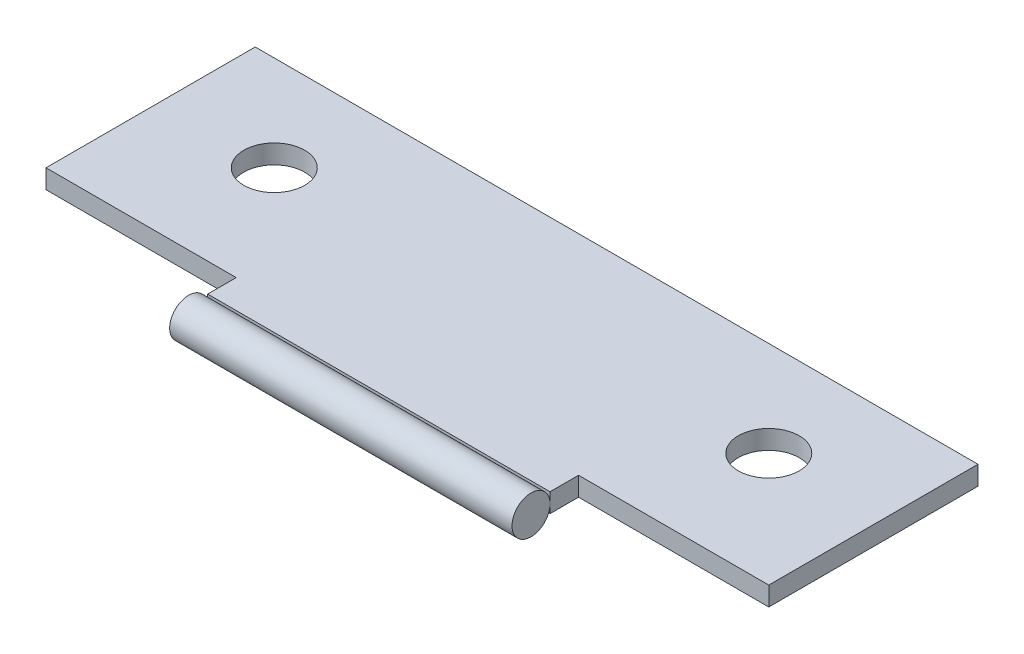
ISO-10303-21;
HEADER;
FILE_DESCRIPTION(('STEP AP214'),'2;1');
FILE_NAME('part.step','',(''),(''),'','','');
FILE_SCHEMA(('AUTOMOTIVE_DESIGN { 1 0 10303 214 1 1 1 1 }'));
ENDSEC;
DATA;
#1=APPLICATION_CONTEXT('core data for automotive mechanical design processes');
#2=APPLICATION_PROTOCOL_DEFINITION('international standard','automotive_design',2000,#1);
#3=PRODUCT_CONTEXT('',#1,'mechanical');
#4=PRODUCT('Part','Part','',(#3));
#5=PRODUCT_RELATED_PRODUCT_CATEGORY('part','',(#4));
#6=PRODUCT_DEFINITION_FORMATION('','',#4);
#7=PRODUCT_DEFINITION_CONTEXT('part definition',#1,'design');
#8=PRODUCT_DEFINITION('design','',#6,#7);
#9=PRODUCT_DEFINITION_SHAPE('','',#8);
#10=(LENGTH_UNIT() NAMED_UNIT(*) SI_UNIT(.MILLI.,.METRE.));
#11=(NAMED_UNIT(*) PLANE_ANGLE_UNIT() SI_UNIT($,.RADIAN.));
#12=(NAMED_UNIT(*) SI_UNIT($,.STERADIAN.) SOLID_ANGLE_UNIT());
#13=UNCERTAINTY_MEASURE_WITH_UNIT(LENGTH_MEASURE(1.E-05),#10,'distance_accuracy_value','');
#14=(GEOMETRIC_REPRESENTATION_CONTEXT(3) GLOBAL_UNCERTAINTY_ASSIGNED_CONTEXT((#13)) GLOBAL_UNIT_ASSIGNED_CONTEXT((#10,
#11,#12)) REPRESENTATION_CONTEXT('',''));
#15=CARTESIAN_POINT('',(0.,0.,0.));
#16=DIRECTION('',(0.,0.,1.));
#17=DIRECTION('',(1.,0.,0.));
#18=AXIS2_PLACEMENT_3D('',#15,#16,#17);
#19=CARTESIAN_POINT('',(-11.8284271247462,0.445452926267489,7.9999999999999));
#20=DIRECTION('',(1.,0.,0.));
#21=DIRECTION('',(0.,0.,-1.));
#22=AXIS2_PLACEMENT_3D('',#19,#20,#21);
#23=CYLINDRICAL_SURFACE('',#22,1.);
#24=CARTESIAN_POINT('',(-9.00000000000001,0.445452926267489,7.99999999999991));
#25=DIRECTION('',(1.,0.,0.));
#26=DIRECTION('',(0.,0.,-1.));
#27=AXIS2_PLACEMENT_3D('',#24,#25,#26);
#28=CIRCLE('',#27,1.);
#29=CARTESIAN_POINT('',(-9.00000000000001,0.445452926267489,6.99999999999991));
#30=VERTEX_POINT('',#29);
#31=EDGE_CURVE('E11',#30,#30,#28,.F.);
#32=ORIENTED_EDGE('',*,*,#31,.F.);
#33=EDGE_LOOP('',(#32));
#34=FACE_BOUND('',#33,.T.);
#35=CARTESIAN_POINT('',(8.99999999999999,0.445452926267489,8.));
#36=DIRECTION('',(1.,0.,0.));
#37=DIRECTION('',(0.,0.,-1.));
#38=AXIS2_PLACEMENT_3D('',#35,#36,#37);
#39=CIRCLE('',#38,1.);
#40=CARTESIAN_POINT('',(9.,0.445452926267489,7.));
#41=VERTEX_POINT('',#40);
#42=EDGE_CURVE('E59',#41,#41,#39,.T.);
#43=ORIENTED_EDGE('',*,*,#42,.F.);
#44=EDGE_LOOP('',(#43));
#45=FACE_BOUND('',#44,.T.);
#46=ADVANCED_FACE('F53',(#34,#45),#23,.T.);
#47=CARTESIAN_POINT('',(8.99999999999999,0.445452926267489,8.));
#48=DIRECTION('',(1.,0.,0.));
#49=DIRECTION('',(0.,0.,-1.));
#50=AXIS2_PLACEMENT_3D('',#47,#48,#49);
#51=PLANE('',#50);
#52=ORIENTED_EDGE('',*,*,#42,.T.);
#53=EDGE_LOOP('',(#52));
#54=FACE_BOUND('',#53,.T.);
#55=ADVANCED_FACE('F65',(#54),#51,.T.);
#56=CARTESIAN_POINT('',(-9.,1.,5.5));
#57=DIRECTION('',(1.,0.,0.));
#58=DIRECTION('',(0.,0.,-1.));
#59=AXIS2_PLACEMENT_3D('',#56,#57,#58);
#60=PLANE('',#59);
#61=ORIENTED_EDGE('',*,*,#31,.T.);
#62=EDGE_LOOP('',(#61));
#63=FACE_BOUND('',#62,.T.);
#64=ADVANCED_FACE('F72',(#63),#60,.F.);
#65=CLOSED_SHELL('',(#46,#55,#64));
#66=MANIFOLD_SOLID_BREP('B2',#65);
#67=CARTESIAN_POINT('',(9.,1.,5.5));
#68=DIRECTION('',(0.,0.,-1.));
#69=DIRECTION('',(-1.,0.,0.));
#70=AXIS2_PLACEMENT_3D('',#67,#68,#69);
#71=PLANE('',#70);
#72=DIRECTION('',(1.,0.,0.));
#73=VECTOR('',#72,1.);
#74=CARTESIAN_POINT('',(9.,0.,5.5));
#75=LINE('',#74,#73);
#76=CARTESIAN_POINT('',(9.,0.,5.5));
#77=VERTEX_POINT('',#76);
#78=CARTESIAN_POINT('',(19.,0.,5.5));
#79=VERTEX_POINT('',#78);
#80=EDGE_CURVE('E194',#77,#79,#75,.T.);
#81=ORIENTED_EDGE('',*,*,#80,.T.);
#82=DIRECTION('',(0.,-1.,0.));
#83=VECTOR('',#82,1.);
#84=CARTESIAN_POINT('',(19.,1.,5.5));
#85=LINE('',#84,#83);
#86=CARTESIAN_POINT('',(19.,1.,5.5));
#87=VERTEX_POINT('',#86);
#88=EDGE_CURVE('E51',#87,#79,#85,.T.);
#89=ORIENTED_EDGE('',*,*,#88,.F.);
#90=DIRECTION('',(1.,0.,0.));
#91=VECTOR('',#90,1.);
#92=CARTESIAN_POINT('',(9.,1.,5.5));
#93=LINE('',#92,#91);
#94=CARTESIAN_POINT('',(9.,1.,5.5));
#95=VERTEX_POINT('',#94);
#96=EDGE_CURVE('E218',#95,#87,#93,.T.);
#97=ORIENTED_EDGE('',*,*,#96,.F.);
#98=DIRECTION('',(0.,-1.,0.));
#99=VECTOR('',#98,1.);
#100=CARTESIAN_POINT('',(9.,1.,5.5));
#101=LINE('',#100,#99);
#102=EDGE_CURVE('E190',#95,#77,#101,.T.);
#103=ORIENTED_EDGE('',*,*,#102,.T.);
#104=EDGE_LOOP('',(#81,#89,#97,#103));
#105=FACE_BOUND('',#104,.T.);
#106=ADVANCED_FACE('F94',(#105),#71,.F.);
#107=CARTESIAN_POINT('',(19.,1.,-5.5));
#108=DIRECTION('',(-1.,0.,0.));
#109=DIRECTION('',(0.,0.,1.));
#110=AXIS2_PLACEMENT_3D('',#107,#108,#109);
#111=PLANE('',#110);
#112=DIRECTION('',(0.,0.,-1.));
#113=VECTOR('',#112,1.);
#114=CARTESIAN_POINT('',(19.,0.,-5.5));
#115=LINE('',#114,#113);
#116=CARTESIAN_POINT('',(19.,0.,-5.5));
#117=VERTEX_POINT('',#116);
#118=EDGE_CURVE('E198',#79,#117,#115,.T.);
#119=ORIENTED_EDGE('',*,*,#118,.T.);
#120=DIRECTION('',(0.,-1.,0.));
#121=VECTOR('',#120,1.);
#122=CARTESIAN_POINT('',(19.,1.,-5.5));
#123=LINE('',#122,#121);
#124=CARTESIAN_POINT('',(19.,1.,-5.5));
#125=VERTEX_POINT('',#124);
#126=EDGE_CURVE('E103',#125,#117,#123,.T.);
#127=ORIENTED_EDGE('',*,*,#126,.F.);
#128=DIRECTION('',(0.,0.,-1.));
#129=VECTOR('',#128,1.);
#130=CARTESIAN_POINT('',(19.,1.,-5.5));
#131=LINE('',#130,#129);
#132=EDGE_CURVE('E151',#87,#125,#131,.T.);
#133=ORIENTED_EDGE('',*,*,#132,.F.);
#134=ORIENTED_EDGE('',*,*,#88,.T.);
#135=EDGE_LOOP('',(#119,#127,#133,#134));
#136=FACE_BOUND('',#135,.T.);
#137=ADVANCED_FACE('F302',(#136),#111,.F.);
#138=CARTESIAN_POINT('',(-19.,1.,-5.5));
#139=DIRECTION('',(0.,0.,1.));
#140=DIRECTION('',(1.,0.,0.));
#141=AXIS2_PLACEMENT_3D('',#138,#139,#140);
#142=PLANE('',#141);
#143=DIRECTION('',(-1.,0.,0.));
#144=VECTOR('',#143,1.);
#145=CARTESIAN_POINT('',(-19.,0.,-5.5));
#146=LINE('',#145,#144);
#147=CARTESIAN_POINT('',(-19.,0.,-5.5));
#148=VERTEX_POINT('',#147);
#149=EDGE_CURVE('E202',#117,#148,#146,.T.);
#150=ORIENTED_EDGE('',*,*,#149,.T.);
#151=DIRECTION('',(0.,-1.,0.));
#152=VECTOR('',#151,1.);
#153=CARTESIAN_POINT('',(-19.,1.,-5.5));
#154=LINE('',#153,#152);
#155=CARTESIAN_POINT('',(-19.,1.,-5.5));
#156=VERTEX_POINT('',#155);
#157=EDGE_CURVE('E229',#156,#148,#154,.T.);
#158=ORIENTED_EDGE('',*,*,#157,.F.);
#159=DIRECTION('',(-1.,0.,0.));
#160=VECTOR('',#159,1.);
#161=CARTESIAN_POINT('',(-19.,1.,-5.5));
#162=LINE('',#161,#160);
#163=EDGE_CURVE('E239',#125,#156,#162,.T.);
#164=ORIENTED_EDGE('',*,*,#163,.F.);
#165=ORIENTED_EDGE('',*,*,#126,.T.);
#166=EDGE_LOOP('',(#150,#158,#164,#165));
#167=FACE_BOUND('',#166,.T.);
#168=ADVANCED_FACE('F237',(#167),#142,.F.);
#169=CARTESIAN_POINT('',(-19.,1.,-5.5));
#170=DIRECTION('',(1.,0.,0.));
#171=DIRECTION('',(0.,0.,-1.));
#172=AXIS2_PLACEMENT_3D('',#169,#170,#171);
#173=PLANE('',#172);
#174=DIRECTION('',(0.,0.,1.));
#175=VECTOR('',#174,1.);
#176=CARTESIAN_POINT('',(-19.,0.,-5.5));
#177=LINE('',#176,#175);
#178=CARTESIAN_POINT('',(-19.,0.,5.5));
#179=VERTEX_POINT('',#178);
#180=EDGE_CURVE('E205',#148,#179,#177,.T.);
#181=ORIENTED_EDGE('',*,*,#180,.T.);
#182=DIRECTION('',(0.,-1.,0.));
#183=VECTOR('',#182,1.);
#184=CARTESIAN_POINT('',(-19.,1.,5.5));
#185=LINE('',#184,#183);
#186=CARTESIAN_POINT('',(-19.,1.,5.5));
#187=VERTEX_POINT('',#186);
#188=EDGE_CURVE('E225',#187,#179,#185,.T.);
#189=ORIENTED_EDGE('',*,*,#188,.F.);
#190=DIRECTION('',(0.,0.,1.));
#191=VECTOR('',#190,1.);
#192=CARTESIAN_POINT('',(-19.,1.,-5.5));
#193=LINE('',#192,#191);
#194=EDGE_CURVE('E252',#156,#187,#193,.T.);
#195=ORIENTED_EDGE('',*,*,#194,.F.);
#196=ORIENTED_EDGE('',*,*,#157,.T.);
#197=EDGE_LOOP('',(#181,#189,#195,#196));
#198=FACE_BOUND('',#197,.T.);
#199=ADVANCED_FACE('F247',(#198),#173,.F.);
#200=CARTESIAN_POINT('',(-19.,1.,5.5));
#201=DIRECTION('',(0.,0.,-1.));
#202=DIRECTION('',(-1.,0.,0.));
#203=AXIS2_PLACEMENT_3D('',#200,#201,#202);
#204=PLANE('',#203);
#205=DIRECTION('',(1.,0.,0.));
#206=VECTOR('',#205,1.);
#207=CARTESIAN_POINT('',(-19.,0.,5.5));
#208=LINE('',#207,#206);
#209=CARTESIAN_POINT('',(-9.,0.,5.5));
#210=VERTEX_POINT('',#209);
#211=EDGE_CURVE('E208',#179,#210,#208,.T.);
#212=ORIENTED_EDGE('',*,*,#211,.T.);
#213=DIRECTION('',(0.,-1.,0.));
#214=VECTOR('',#213,1.);
#215=CARTESIAN_POINT('',(-9.,1.,5.5));
#216=LINE('',#215,#214);
#217=CARTESIAN_POINT('',(-9.,1.,5.5));
#218=VERTEX_POINT('',#217);
#219=EDGE_CURVE('E184',#218,#210,#216,.T.);
#220=ORIENTED_EDGE('',*,*,#219,.F.);
#221=DIRECTION('',(1.,0.,0.));
#222=VECTOR('',#221,1.);
#223=CARTESIAN_POINT('',(-19.,1.,5.5));
#224=LINE('',#223,#222);
#225=EDGE_CURVE('E170',#187,#218,#224,.T.);
#226=ORIENTED_EDGE('',*,*,#225,.F.);
#227=ORIENTED_EDGE('',*,*,#188,.T.);
#228=EDGE_LOOP('',(#212,#220,#226,#227));
#229=FACE_BOUND('',#228,.T.);
#230=ADVANCED_FACE('F250',(#229),#204,.F.);
#231=CARTESIAN_POINT('',(-9.,1.,5.5));
#232=DIRECTION('',(1.,0.,0.));
#233=DIRECTION('',(0.,0.,-1.));
#234=AXIS2_PLACEMENT_3D('',#231,#232,#233);
#235=PLANE('',#234);
#236=DIRECTION('',(0.,0.,1.));
#237=VECTOR('',#236,1.);
#238=CARTESIAN_POINT('',(-9.,0.,5.5));
#239=LINE('',#238,#237);
#240=CARTESIAN_POINT('',(-9.00000000000001,0.,7.));
#241=VERTEX_POINT('',#240);
#242=EDGE_CURVE('E180',#210,#241,#239,.T.);
#243=ORIENTED_EDGE('',*,*,#242,.T.);
#244=DIRECTION('',(0.,-1.,0.));
#245=VECTOR('',#244,1.);
#246=CARTESIAN_POINT('',(-9.00000000000001,1.,7.));
#247=LINE('',#246,#245);
#248=CARTESIAN_POINT('',(-9.00000000000001,1.,7.));
#249=VERTEX_POINT('',#248);
#250=EDGE_CURVE('E177',#249,#241,#247,.T.);
#251=ORIENTED_EDGE('',*,*,#250,.F.);
#252=DIRECTION('',(0.,0.,1.));
#253=VECTOR('',#252,1.);
#254=CARTESIAN_POINT('',(-9.,1.,5.5));
#255=LINE('',#254,#253);
#256=EDGE_CURVE('E164',#218,#249,#255,.T.);
#257=ORIENTED_EDGE('',*,*,#256,.F.);
#258=ORIENTED_EDGE('',*,*,#219,.T.);
#259=EDGE_LOOP('',(#243,#251,#257,#258));
#260=FACE_BOUND('',#259,.T.);
#261=ADVANCED_FACE('F178',(#260),#235,.F.);
#262=CARTESIAN_POINT('',(-9.00000000000001,1.,7.));
#263=DIRECTION('',(0.,0.,-1.));
#264=DIRECTION('',(-1.,0.,0.));
#265=AXIS2_PLACEMENT_3D('',#262,#263,#264);
#266=PLANE('',#265);
#267=ORIENTED_EDGE('',*,*,#250,.T.);
#268=DIRECTION('',(1.,0.,0.));
#269=VECTOR('',#268,1.);
#270=CARTESIAN_POINT('',(-9.00000000000001,0.,7.));
#271=LINE('',#270,#269);
#272=CARTESIAN_POINT('',(8.99999999999999,0.,7.));
#273=VERTEX_POINT('',#272);
#274=EDGE_CURVE('E213',#241,#273,#271,.T.);
#275=ORIENTED_EDGE('',*,*,#274,.T.);
#276=DIRECTION('',(0.,-1.,0.));
#277=VECTOR('',#276,1.);
#278=CARTESIAN_POINT('',(8.99999999999999,1.,7.));
#279=LINE('',#278,#277);
#280=CARTESIAN_POINT('',(8.99999999999999,1.,7.));
#281=VERTEX_POINT('',#280);
#282=EDGE_CURVE('E139',#281,#273,#279,.T.);
#283=ORIENTED_EDGE('',*,*,#282,.F.);
#284=DIRECTION('',(1.,0.,0.));
#285=VECTOR('',#284,1.);
#286=CARTESIAN_POINT('',(-9.00000000000001,1.,7.));
#287=LINE('',#286,#285);
#288=EDGE_CURVE('E168',#249,#281,#287,.T.);
#289=ORIENTED_EDGE('',*,*,#288,.F.);
#290=EDGE_LOOP('',(#267,#275,#283,#289));
#291=FACE_BOUND('',#290,.T.);
#292=ADVANCED_FACE('F186',(#291),#266,.F.);
#293=CARTESIAN_POINT('',(8.99999999999999,1.,7.));
#294=DIRECTION('',(-1.,0.,0.));
#295=DIRECTION('',(0.,0.,1.));
#296=AXIS2_PLACEMENT_3D('',#293,#294,#295);
#297=PLANE('',#296);
#298=DIRECTION('',(0.,0.,-1.));
#299=VECTOR('',#298,1.);
#300=CARTESIAN_POINT('',(8.99999999999999,0.,7.));
#301=LINE('',#300,#299);
#302=EDGE_CURVE('E143',#273,#77,#301,.T.);
#303=ORIENTED_EDGE('',*,*,#302,.T.);
#304=ORIENTED_EDGE('',*,*,#102,.F.);
#305=DIRECTION('',(0.,0.,-1.));
#306=VECTOR('',#305,1.);
#307=CARTESIAN_POINT('',(8.99999999999999,1.,7.));
#308=LINE('',#307,#306);
#309=EDGE_CURVE('E111',#281,#95,#308,.T.);
#310=ORIENTED_EDGE('',*,*,#309,.F.);
#311=ORIENTED_EDGE('',*,*,#282,.T.);
#312=EDGE_LOOP('',(#303,#304,#310,#311));
#313=FACE_BOUND('',#312,.T.);
#314=ADVANCED_FACE('F289',(#313),#297,.F.);
#315=CARTESIAN_POINT('',(0.,1.,0.));
#316=DIRECTION('',(0.,-1.,0.));
#317=DIRECTION('',(0.,0.,-1.));
#318=AXIS2_PLACEMENT_3D('',#315,#316,#317);
#319=PLANE('',#318);
#320=CARTESIAN_POINT('',(-13.,1.,-0.5));
#321=DIRECTION('',(0.,1.,0.));
#322=DIRECTION('',(0.,0.,1.));
#323=AXIS2_PLACEMENT_3D('',#320,#321,#322);
#324=CIRCLE('',#323,1.6);
#325=CARTESIAN_POINT('',(-13.,1.,1.1));
#326=VERTEX_POINT('',#325);
#327=EDGE_CURVE('E270',#326,#326,#324,.T.);
#328=ORIENTED_EDGE('',*,*,#327,.F.);
#329=EDGE_LOOP('',(#328));
#330=FACE_BOUND('',#329,.T.);
#331=CARTESIAN_POINT('',(13.,1.,-0.5));
#332=DIRECTION('',(0.,1.,0.));
#333=DIRECTION('',(0.,0.,1.));
#334=AXIS2_PLACEMENT_3D('',#331,#332,#333);
#335=CIRCLE('',#334,1.6);
#336=CARTESIAN_POINT('',(13.,1.,1.1));
#337=VERTEX_POINT('',#336);
#338=EDGE_CURVE('E266',#337,#337,#335,.T.);
#339=ORIENTED_EDGE('',*,*,#338,.F.);
#340=EDGE_LOOP('',(#339));
#341=FACE_BOUND('',#340,.T.);
#342=ORIENTED_EDGE('',*,*,#96,.T.);
#343=ORIENTED_EDGE('',*,*,#132,.T.);
#344=ORIENTED_EDGE('',*,*,#163,.T.);
#345=ORIENTED_EDGE('',*,*,#194,.T.);
#346=ORIENTED_EDGE('',*,*,#225,.T.);
#347=ORIENTED_EDGE('',*,*,#256,.T.);
#348=ORIENTED_EDGE('',*,*,#288,.T.);
#349=ORIENTED_EDGE('',*,*,#309,.T.);
#350=EDGE_LOOP('',(#342,#343,#344,#345,#346,#347,#348,#349));
#351=FACE_BOUND('',#350,.T.);
#352=ADVANCED_FACE('F166',(#330,#341,#351),#319,.F.);
#353=CARTESIAN_POINT('',(0.,0.,0.));
#354=DIRECTION('',(0.,-1.,0.));
#355=DIRECTION('',(0.,0.,-1.));
#356=AXIS2_PLACEMENT_3D('',#353,#354,#355);
#357=PLANE('',#356);
#358=CARTESIAN_POINT('',(-13.,0.,-0.5));
#359=DIRECTION('',(0.,1.,0.));
#360=DIRECTION('',(0.,0.,1.));
#361=AXIS2_PLACEMENT_3D('',#358,#359,#360);
#362=CIRCLE('',#361,1.6);
#363=CARTESIAN_POINT('',(-13.,0.,1.1));
#364=VERTEX_POINT('',#363);
#365=EDGE_CURVE('E199',#364,#364,#362,.T.);
#366=ORIENTED_EDGE('',*,*,#365,.T.);
#367=EDGE_LOOP('',(#366));
#368=FACE_BOUND('',#367,.T.);
#369=CARTESIAN_POINT('',(13.,0.,-0.5));
#370=DIRECTION('',(0.,1.,0.));
#371=DIRECTION('',(0.,0.,1.));
#372=AXIS2_PLACEMENT_3D('',#369,#370,#371);
#373=CIRCLE('',#372,1.6);
#374=CARTESIAN_POINT('',(13.,0.,1.1));
#375=VERTEX_POINT('',#374);
#376=EDGE_CURVE('E262',#375,#375,#373,.T.);
#377=ORIENTED_EDGE('',*,*,#376,.T.);
#378=EDGE_LOOP('',(#377));
#379=FACE_BOUND('',#378,.T.);
#380=ORIENTED_EDGE('',*,*,#80,.F.);
#381=ORIENTED_EDGE('',*,*,#302,.F.);
#382=ORIENTED_EDGE('',*,*,#274,.F.);
#383=ORIENTED_EDGE('',*,*,#242,.F.);
#384=ORIENTED_EDGE('',*,*,#211,.F.);
#385=ORIENTED_EDGE('',*,*,#180,.F.);
#386=ORIENTED_EDGE('',*,*,#149,.F.);
#387=ORIENTED_EDGE('',*,*,#118,.F.);
#388=EDGE_LOOP('',(#380,#381,#382,#383,#384,#385,#386,#387));
#389=FACE_BOUND('',#388,.T.);
#390=ADVANCED_FACE('F243',(#368,#379,#389),#357,.T.);
#391=CARTESIAN_POINT('',(13.,0.,-0.5));
#392=DIRECTION('',(0.,1.,0.));
#393=DIRECTION('',(0.,0.,1.));
#394=AXIS2_PLACEMENT_3D('',#391,#392,#393);
#395=CYLINDRICAL_SURFACE('',#394,1.6);
#396=ORIENTED_EDGE('',*,*,#376,.F.);
#397=EDGE_LOOP('',(#396));
#398=FACE_BOUND('',#397,.T.);
#399=ORIENTED_EDGE('',*,*,#338,.T.);
#400=EDGE_LOOP('',(#399));
#401=FACE_BOUND('',#400,.T.);
#402=ADVANCED_FACE('F283',(#398,#401),#395,.F.);
#403=CARTESIAN_POINT('',(-13.,0.,-0.5));
#404=DIRECTION('',(0.,1.,0.));
#405=DIRECTION('',(0.,0.,1.));
#406=AXIS2_PLACEMENT_3D('',#403,#404,#405);
#407=CYLINDRICAL_SURFACE('',#406,1.6);
#408=ORIENTED_EDGE('',*,*,#365,.F.);
#409=EDGE_LOOP('',(#408));
#410=FACE_BOUND('',#409,.T.);
#411=ORIENTED_EDGE('',*,*,#327,.T.);
#412=EDGE_LOOP('',(#411));
#413=FACE_BOUND('',#412,.T.);
#414=ADVANCED_FACE('F280',(#410,#413),#407,.F.);
#415=CLOSED_SHELL('',(#106,#137,#168,#199,#230,#261,#292,#314,#352,#390,#402,#414));
#416=MANIFOLD_SOLID_BREP('B6',#415);
#417=ADVANCED_BREP_SHAPE_REPRESENTATION('',(#18,#66,#416),#14);
#418=SHAPE_DEFINITION_REPRESENTATION(#9,#417);
ENDSEC;
END-ISO-10303-21;
